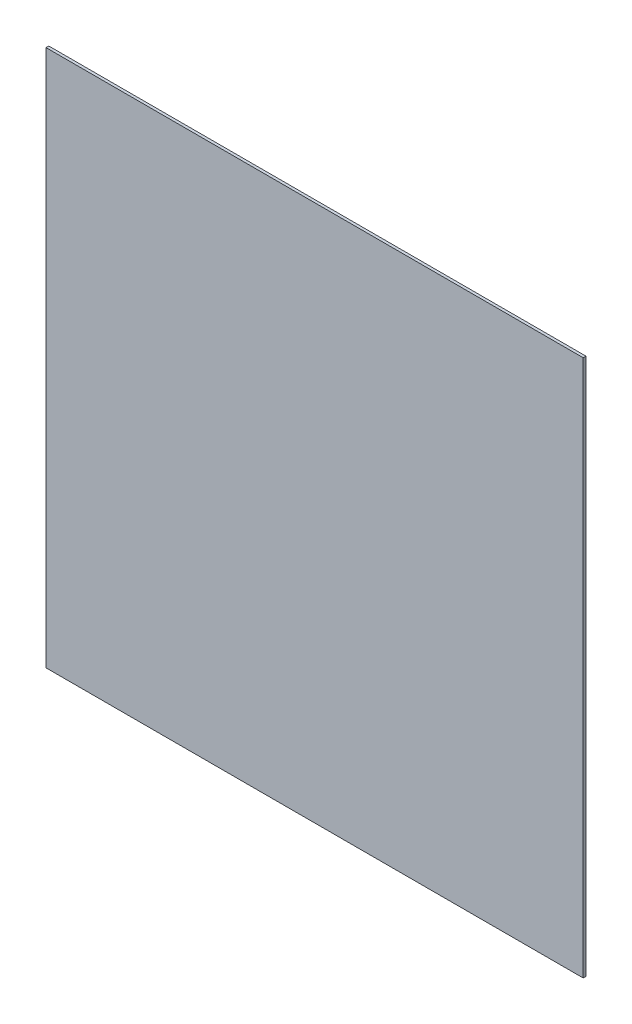
ISO-10303-21;
HEADER;
FILE_DESCRIPTION(('STEP AP214'),'2;1');
FILE_NAME('part.step','',(''),(''),'','','');
FILE_SCHEMA(('AUTOMOTIVE_DESIGN { 1 0 10303 214 1 1 1 1 }'));
ENDSEC;
DATA;
#1=APPLICATION_CONTEXT('core data for automotive mechanical design processes');
#2=APPLICATION_PROTOCOL_DEFINITION('international standard','automotive_design',2000,#1);
#3=PRODUCT_CONTEXT('',#1,'mechanical');
#4=PRODUCT('Part','Part','',(#3));
#5=PRODUCT_RELATED_PRODUCT_CATEGORY('part','',(#4));
#6=PRODUCT_DEFINITION_FORMATION('','',#4);
#7=PRODUCT_DEFINITION_CONTEXT('part definition',#1,'design');
#8=PRODUCT_DEFINITION('design','',#6,#7);
#9=PRODUCT_DEFINITION_SHAPE('','',#8);
#10=(LENGTH_UNIT() NAMED_UNIT(*) SI_UNIT(.MILLI.,.METRE.));
#11=(NAMED_UNIT(*) PLANE_ANGLE_UNIT() SI_UNIT($,.RADIAN.));
#12=(NAMED_UNIT(*) SI_UNIT($,.STERADIAN.) SOLID_ANGLE_UNIT());
#13=UNCERTAINTY_MEASURE_WITH_UNIT(LENGTH_MEASURE(1.E-05),#10,'distance_accuracy_value','');
#14=(GEOMETRIC_REPRESENTATION_CONTEXT(3) GLOBAL_UNCERTAINTY_ASSIGNED_CONTEXT((#13)) GLOBAL_UNIT_ASSIGNED_CONTEXT((#10,
#11,#12)) REPRESENTATION_CONTEXT('',''));
#15=CARTESIAN_POINT('',(0.,0.,0.));
#16=DIRECTION('',(0.,0.,1.));
#17=DIRECTION('',(1.,0.,0.));
#18=AXIS2_PLACEMENT_3D('',#15,#16,#17);
#19=CARTESIAN_POINT('',(307.975,-307.975,3.175));
#20=DIRECTION('',(-1.,0.,0.));
#21=DIRECTION('',(0.,0.,1.));
#22=AXIS2_PLACEMENT_3D('',#19,#20,#21);
#23=PLANE('',#22);
#24=DIRECTION('',(0.,1.,0.));
#25=VECTOR('',#24,1.);
#26=CARTESIAN_POINT('',(307.975,-307.975,0.));
#27=LINE('',#26,#25);
#28=CARTESIAN_POINT('',(307.975,-307.975,0.));
#29=VERTEX_POINT('',#28);
#30=CARTESIAN_POINT('',(307.975,307.975,0.));
#31=VERTEX_POINT('',#30);
#32=EDGE_CURVE('E101',#29,#31,#27,.T.);
#33=ORIENTED_EDGE('',*,*,#32,.T.);
#34=DIRECTION('',(0.,0.,-1.));
#35=VECTOR('',#34,1.);
#36=CARTESIAN_POINT('',(307.975,307.975,3.175));
#37=LINE('',#36,#35);
#38=CARTESIAN_POINT('',(307.975,307.975,3.175));
#39=VERTEX_POINT('',#38);
#40=EDGE_CURVE('E11',#39,#31,#37,.T.);
#41=ORIENTED_EDGE('',*,*,#40,.F.);
#42=DIRECTION('',(0.,1.,0.));
#43=VECTOR('',#42,1.);
#44=CARTESIAN_POINT('',(307.975,-307.975,3.175));
#45=LINE('',#44,#43);
#46=CARTESIAN_POINT('',(307.975,-307.975,3.175));
#47=VERTEX_POINT('',#46);
#48=EDGE_CURVE('E89',#47,#39,#45,.T.);
#49=ORIENTED_EDGE('',*,*,#48,.F.);
#50=DIRECTION('',(0.,0.,-1.));
#51=VECTOR('',#50,1.);
#52=CARTESIAN_POINT('',(307.975,-307.975,3.175));
#53=LINE('',#52,#51);
#54=EDGE_CURVE('E97',#47,#29,#53,.T.);
#55=ORIENTED_EDGE('',*,*,#54,.T.);
#56=EDGE_LOOP('',(#33,#41,#49,#55));
#57=FACE_BOUND('',#56,.T.);
#58=ADVANCED_FACE('F38',(#57),#23,.F.);
#59=CARTESIAN_POINT('',(-307.975,307.975,3.175));
#60=DIRECTION('',(0.,-1.,0.));
#61=DIRECTION('',(0.,0.,-1.));
#62=AXIS2_PLACEMENT_3D('',#59,#60,#61);
#63=PLANE('',#62);
#64=DIRECTION('',(-1.,0.,0.));
#65=VECTOR('',#64,1.);
#66=CARTESIAN_POINT('',(-307.975,307.975,0.));
#67=LINE('',#66,#65);
#68=CARTESIAN_POINT('',(-307.975,307.975,0.));
#69=VERTEX_POINT('',#68);
#70=EDGE_CURVE('E93',#31,#69,#67,.T.);
#71=ORIENTED_EDGE('',*,*,#70,.T.);
#72=DIRECTION('',(0.,0.,-1.));
#73=VECTOR('',#72,1.);
#74=CARTESIAN_POINT('',(-307.975,307.975,3.175));
#75=LINE('',#74,#73);
#76=CARTESIAN_POINT('',(-307.975,307.975,3.175));
#77=VERTEX_POINT('',#76);
#78=EDGE_CURVE('E46',#77,#69,#75,.T.);
#79=ORIENTED_EDGE('',*,*,#78,.F.);
#80=DIRECTION('',(-1.,0.,0.));
#81=VECTOR('',#80,1.);
#82=CARTESIAN_POINT('',(-307.975,307.975,3.175));
#83=LINE('',#82,#81);
#84=EDGE_CURVE('E84',#39,#77,#83,.T.);
#85=ORIENTED_EDGE('',*,*,#84,.F.);
#86=ORIENTED_EDGE('',*,*,#40,.T.);
#87=EDGE_LOOP('',(#71,#79,#85,#86));
#88=FACE_BOUND('',#87,.T.);
#89=ADVANCED_FACE('F92',(#88),#63,.F.);
#90=CARTESIAN_POINT('',(-307.975,-307.975,3.175));
#91=DIRECTION('',(1.,0.,0.));
#92=DIRECTION('',(0.,0.,-1.));
#93=AXIS2_PLACEMENT_3D('',#90,#91,#92);
#94=PLANE('',#93);
#95=DIRECTION('',(0.,-1.,0.));
#96=VECTOR('',#95,1.);
#97=CARTESIAN_POINT('',(-307.975,-307.975,0.));
#98=LINE('',#97,#96);
#99=CARTESIAN_POINT('',(-307.975,-307.975,0.));
#100=VERTEX_POINT('',#99);
#101=EDGE_CURVE('E71',#69,#100,#98,.T.);
#102=ORIENTED_EDGE('',*,*,#101,.T.);
#103=DIRECTION('',(0.,0.,-1.));
#104=VECTOR('',#103,1.);
#105=CARTESIAN_POINT('',(-307.975,-307.975,3.175));
#106=LINE('',#105,#104);
#107=CARTESIAN_POINT('',(-307.975,-307.975,3.175));
#108=VERTEX_POINT('',#107);
#109=EDGE_CURVE('E94',#108,#100,#106,.T.);
#110=ORIENTED_EDGE('',*,*,#109,.F.);
#111=DIRECTION('',(0.,-1.,0.));
#112=VECTOR('',#111,1.);
#113=CARTESIAN_POINT('',(-307.975,-307.975,3.175));
#114=LINE('',#113,#112);
#115=EDGE_CURVE('E87',#77,#108,#114,.T.);
#116=ORIENTED_EDGE('',*,*,#115,.F.);
#117=ORIENTED_EDGE('',*,*,#78,.T.);
#118=EDGE_LOOP('',(#102,#110,#116,#117));
#119=FACE_BOUND('',#118,.T.);
#120=ADVANCED_FACE('F95',(#119),#94,.F.);
#121=CARTESIAN_POINT('',(-307.975,-307.975,3.175));
#122=DIRECTION('',(0.,1.,0.));
#123=DIRECTION('',(0.,0.,1.));
#124=AXIS2_PLACEMENT_3D('',#121,#122,#123);
#125=PLANE('',#124);
#126=DIRECTION('',(1.,0.,0.));
#127=VECTOR('',#126,1.);
#128=CARTESIAN_POINT('',(-307.975,-307.975,0.));
#129=LINE('',#128,#127);
#130=EDGE_CURVE('E77',#100,#29,#129,.T.);
#131=ORIENTED_EDGE('',*,*,#130,.T.);
#132=ORIENTED_EDGE('',*,*,#54,.F.);
#133=DIRECTION('',(1.,0.,0.));
#134=VECTOR('',#133,1.);
#135=CARTESIAN_POINT('',(-307.975,-307.975,3.175));
#136=LINE('',#135,#134);
#137=EDGE_CURVE('E54',#108,#47,#136,.T.);
#138=ORIENTED_EDGE('',*,*,#137,.F.);
#139=ORIENTED_EDGE('',*,*,#109,.T.);
#140=EDGE_LOOP('',(#131,#132,#138,#139));
#141=FACE_BOUND('',#140,.T.);
#142=ADVANCED_FACE('F108',(#141),#125,.F.);
#143=CARTESIAN_POINT('',(0.,0.,3.175));
#144=DIRECTION('',(0.,0.,-1.));
#145=DIRECTION('',(-1.,0.,0.));
#146=AXIS2_PLACEMENT_3D('',#143,#144,#145);
#147=PLANE('',#146);
#148=ORIENTED_EDGE('',*,*,#48,.T.);
#149=ORIENTED_EDGE('',*,*,#84,.T.);
#150=ORIENTED_EDGE('',*,*,#115,.T.);
#151=ORIENTED_EDGE('',*,*,#137,.T.);
#152=EDGE_LOOP('',(#148,#149,#150,#151));
#153=FACE_BOUND('',#152,.T.);
#154=ADVANCED_FACE('F85',(#153),#147,.F.);
#155=CARTESIAN_POINT('',(0.,0.,0.));
#156=DIRECTION('',(0.,0.,-1.));
#157=DIRECTION('',(-1.,0.,0.));
#158=AXIS2_PLACEMENT_3D('',#155,#156,#157);
#159=PLANE('',#158);
#160=ORIENTED_EDGE('',*,*,#32,.F.);
#161=ORIENTED_EDGE('',*,*,#130,.F.);
#162=ORIENTED_EDGE('',*,*,#101,.F.);
#163=ORIENTED_EDGE('',*,*,#70,.F.);
#164=EDGE_LOOP('',(#160,#161,#162,#163));
#165=FACE_BOUND('',#164,.T.);
#166=ADVANCED_FACE('F111',(#165),#159,.T.);
#167=CLOSED_SHELL('',(#58,#89,#120,#142,#154,#166));
#168=MANIFOLD_SOLID_BREP('B2',#167);
#169=ADVANCED_BREP_SHAPE_REPRESENTATION('',(#18,#168),#14);
#170=SHAPE_DEFINITION_REPRESENTATION(#9,#169);
ENDSEC;
END-ISO-10303-21;
